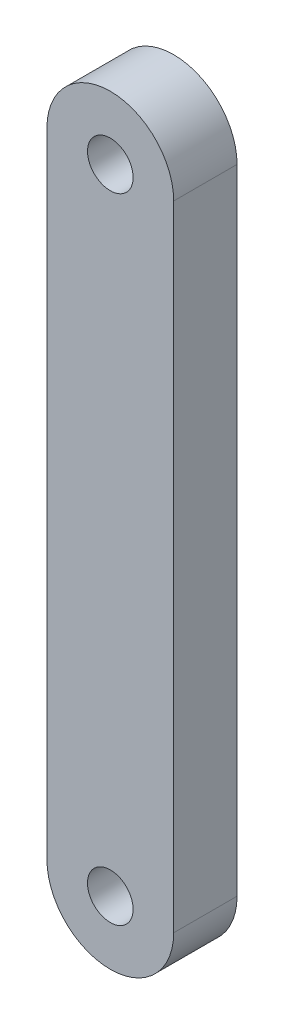
ISO-10303-21;
HEADER;
FILE_DESCRIPTION(('STEP AP214'),'2;1');
FILE_NAME('part.step','',(''),(''),'','','');
FILE_SCHEMA(('AUTOMOTIVE_DESIGN { 1 0 10303 214 1 1 1 1 }'));
ENDSEC;
DATA;
#1=APPLICATION_CONTEXT('core data for automotive mechanical design processes');
#2=APPLICATION_PROTOCOL_DEFINITION('international standard','automotive_design',2000,#1);
#3=PRODUCT_CONTEXT('',#1,'mechanical');
#4=PRODUCT('Part','Part','',(#3));
#5=PRODUCT_RELATED_PRODUCT_CATEGORY('part','',(#4));
#6=PRODUCT_DEFINITION_FORMATION('','',#4);
#7=PRODUCT_DEFINITION_CONTEXT('part definition',#1,'design');
#8=PRODUCT_DEFINITION('design','',#6,#7);
#9=PRODUCT_DEFINITION_SHAPE('','',#8);
#10=(LENGTH_UNIT() NAMED_UNIT(*) SI_UNIT(.MILLI.,.METRE.));
#11=(NAMED_UNIT(*) PLANE_ANGLE_UNIT() SI_UNIT($,.RADIAN.));
#12=(NAMED_UNIT(*) SI_UNIT($,.STERADIAN.) SOLID_ANGLE_UNIT());
#13=UNCERTAINTY_MEASURE_WITH_UNIT(LENGTH_MEASURE(1.E-05),#10,'distance_accuracy_value','');
#14=(GEOMETRIC_REPRESENTATION_CONTEXT(3) GLOBAL_UNCERTAINTY_ASSIGNED_CONTEXT((#13)) GLOBAL_UNIT_ASSIGNED_CONTEXT((#10,
#11,#12)) REPRESENTATION_CONTEXT('',''));
#15=CARTESIAN_POINT('',(0.,0.,0.));
#16=DIRECTION('',(0.,0.,1.));
#17=DIRECTION('',(1.,0.,0.));
#18=AXIS2_PLACEMENT_3D('',#15,#16,#17);
#19=CARTESIAN_POINT('',(0.,25.,5.));
#20=DIRECTION('',(0.,0.,-1.));
#21=DIRECTION('',(-1.,0.,0.));
#22=AXIS2_PLACEMENT_3D('',#19,#20,#21);
#23=CYLINDRICAL_SURFACE('',#22,5.);
#24=CARTESIAN_POINT('',(0.,25.,0.));
#25=DIRECTION('',(0.,0.,1.));
#26=DIRECTION('',(1.,0.,0.));
#27=AXIS2_PLACEMENT_3D('',#24,#25,#26);
#28=CIRCLE('',#27,5.);
#29=CARTESIAN_POINT('',(4.99999999999999,25.,0.));
#30=VERTEX_POINT('',#29);
#31=CARTESIAN_POINT('',(-5.00000000000001,25.,0.));
#32=VERTEX_POINT('',#31);
#33=EDGE_CURVE('E107',#30,#32,#28,.T.);
#34=ORIENTED_EDGE('',*,*,#33,.T.);
#35=DIRECTION('',(0.,0.,-1.));
#36=VECTOR('',#35,1.);
#37=CARTESIAN_POINT('',(-5.00000000000001,25.,5.));
#38=LINE('',#37,#36);
#39=CARTESIAN_POINT('',(-5.00000000000001,25.,5.));
#40=VERTEX_POINT('',#39);
#41=EDGE_CURVE('E11',#40,#32,#38,.T.);
#42=ORIENTED_EDGE('',*,*,#41,.F.);
#43=CARTESIAN_POINT('',(0.,25.,5.));
#44=DIRECTION('',(0.,0.,1.));
#45=DIRECTION('',(1.,0.,0.));
#46=AXIS2_PLACEMENT_3D('',#43,#44,#45);
#47=CIRCLE('',#46,5.);
#48=CARTESIAN_POINT('',(4.99999999999999,25.,5.));
#49=VERTEX_POINT('',#48);
#50=EDGE_CURVE('E91',#49,#40,#47,.T.);
#51=ORIENTED_EDGE('',*,*,#50,.F.);
#52=DIRECTION('',(0.,0.,-1.));
#53=VECTOR('',#52,1.);
#54=CARTESIAN_POINT('',(4.99999999999999,25.,5.));
#55=LINE('',#54,#53);
#56=EDGE_CURVE('E103',#49,#30,#55,.T.);
#57=ORIENTED_EDGE('',*,*,#56,.T.);
#58=EDGE_LOOP('',(#34,#42,#51,#57));
#59=FACE_BOUND('',#58,.T.);
#60=ADVANCED_FACE('F39',(#59),#23,.T.);
#61=CARTESIAN_POINT('',(-5.00000000000001,25.,5.));
#62=DIRECTION('',(1.,0.,0.));
#63=DIRECTION('',(0.,1.,0.));
#64=AXIS2_PLACEMENT_3D('',#61,#62,#63);
#65=PLANE('',#64);
#66=DIRECTION('',(0.,-1.,0.));
#67=VECTOR('',#66,1.);
#68=CARTESIAN_POINT('',(-5.00000000000001,25.,0.));
#69=LINE('',#68,#67);
#70=CARTESIAN_POINT('',(-4.99999999999999,-25.,0.));
#71=VERTEX_POINT('',#70);
#72=EDGE_CURVE('E96',#32,#71,#69,.T.);
#73=ORIENTED_EDGE('',*,*,#72,.T.);
#74=DIRECTION('',(0.,0.,-1.));
#75=VECTOR('',#74,1.);
#76=CARTESIAN_POINT('',(-4.99999999999999,-25.,5.));
#77=LINE('',#76,#75);
#78=CARTESIAN_POINT('',(-4.99999999999999,-25.,5.));
#79=VERTEX_POINT('',#78);
#80=EDGE_CURVE('E48',#79,#71,#77,.T.);
#81=ORIENTED_EDGE('',*,*,#80,.F.);
#82=DIRECTION('',(0.,-1.,0.));
#83=VECTOR('',#82,1.);
#84=CARTESIAN_POINT('',(-5.00000000000001,25.,5.));
#85=LINE('',#84,#83);
#86=EDGE_CURVE('E86',#40,#79,#85,.T.);
#87=ORIENTED_EDGE('',*,*,#86,.F.);
#88=ORIENTED_EDGE('',*,*,#41,.T.);
#89=EDGE_LOOP('',(#73,#81,#87,#88));
#90=FACE_BOUND('',#89,.T.);
#91=ADVANCED_FACE('F95',(#90),#65,.F.);
#92=CARTESIAN_POINT('',(0.,-25.,5.));
#93=DIRECTION('',(0.,0.,-1.));
#94=DIRECTION('',(-1.,0.,0.));
#95=AXIS2_PLACEMENT_3D('',#92,#93,#94);
#96=CYLINDRICAL_SURFACE('',#95,5.);
#97=CARTESIAN_POINT('',(0.,-25.,0.));
#98=DIRECTION('',(0.,0.,1.));
#99=DIRECTION('',(1.,0.,0.));
#100=AXIS2_PLACEMENT_3D('',#97,#98,#99);
#101=CIRCLE('',#100,5.);
#102=CARTESIAN_POINT('',(5.,-25.,0.));
#103=VERTEX_POINT('',#102);
#104=EDGE_CURVE('E73',#71,#103,#101,.T.);
#105=ORIENTED_EDGE('',*,*,#104,.T.);
#106=DIRECTION('',(0.,0.,-1.));
#107=VECTOR('',#106,1.);
#108=CARTESIAN_POINT('',(5.,-25.,5.));
#109=LINE('',#108,#107);
#110=CARTESIAN_POINT('',(5.,-25.,5.));
#111=VERTEX_POINT('',#110);
#112=EDGE_CURVE('E98',#111,#103,#109,.T.);
#113=ORIENTED_EDGE('',*,*,#112,.F.);
#114=CARTESIAN_POINT('',(0.,-25.,5.));
#115=DIRECTION('',(0.,0.,1.));
#116=DIRECTION('',(1.,0.,0.));
#117=AXIS2_PLACEMENT_3D('',#114,#115,#116);
#118=CIRCLE('',#117,5.);
#119=EDGE_CURVE('E89',#79,#111,#118,.T.);
#120=ORIENTED_EDGE('',*,*,#119,.F.);
#121=ORIENTED_EDGE('',*,*,#80,.T.);
#122=EDGE_LOOP('',(#105,#113,#120,#121));
#123=FACE_BOUND('',#122,.T.);
#124=ADVANCED_FACE('F99',(#123),#96,.T.);
#125=CARTESIAN_POINT('',(4.99999999999999,25.,5.));
#126=DIRECTION('',(-1.,0.,0.));
#127=DIRECTION('',(0.,-1.,0.));
#128=AXIS2_PLACEMENT_3D('',#125,#126,#127);
#129=PLANE('',#128);
#130=DIRECTION('',(0.,1.,0.));
#131=VECTOR('',#130,1.);
#132=CARTESIAN_POINT('',(4.99999999999999,25.,0.));
#133=LINE('',#132,#131);
#134=EDGE_CURVE('E79',#103,#30,#133,.T.);
#135=ORIENTED_EDGE('',*,*,#134,.T.);
#136=ORIENTED_EDGE('',*,*,#56,.F.);
#137=DIRECTION('',(0.,1.,0.));
#138=VECTOR('',#137,1.);
#139=CARTESIAN_POINT('',(4.99999999999999,25.,5.));
#140=LINE('',#139,#138);
#141=EDGE_CURVE('E56',#111,#49,#140,.T.);
#142=ORIENTED_EDGE('',*,*,#141,.F.);
#143=ORIENTED_EDGE('',*,*,#112,.T.);
#144=EDGE_LOOP('',(#135,#136,#142,#143));
#145=FACE_BOUND('',#144,.T.);
#146=ADVANCED_FACE('F121',(#145),#129,.F.);
#147=CARTESIAN_POINT('',(0.,25.,5.));
#148=DIRECTION('',(0.,0.,1.));
#149=DIRECTION('',(1.,0.,0.));
#150=AXIS2_PLACEMENT_3D('',#147,#148,#149);
#151=PLANE('',#150);
#152=CARTESIAN_POINT('',(0.,25.,5.));
#153=DIRECTION('',(0.,0.,1.));
#154=DIRECTION('',(1.,0.,0.));
#155=AXIS2_PLACEMENT_3D('',#152,#153,#154);
#156=CIRCLE('',#155,1.8);
#157=CARTESIAN_POINT('',(1.79999999999999,25.,5.));
#158=VERTEX_POINT('',#157);
#159=EDGE_CURVE('E139',#158,#158,#156,.T.);
#160=ORIENTED_EDGE('',*,*,#159,.F.);
#161=EDGE_LOOP('',(#160));
#162=FACE_BOUND('',#161,.T.);
#163=CARTESIAN_POINT('',(0.,-25.,5.));
#164=DIRECTION('',(0.,0.,1.));
#165=DIRECTION('',(1.,0.,0.));
#166=AXIS2_PLACEMENT_3D('',#163,#164,#165);
#167=CIRCLE('',#166,1.8);
#168=CARTESIAN_POINT('',(1.8,-25.,5.));
#169=VERTEX_POINT('',#168);
#170=EDGE_CURVE('E131',#169,#169,#167,.T.);
#171=ORIENTED_EDGE('',*,*,#170,.F.);
#172=EDGE_LOOP('',(#171));
#173=FACE_BOUND('',#172,.T.);
#174=ORIENTED_EDGE('',*,*,#50,.T.);
#175=ORIENTED_EDGE('',*,*,#86,.T.);
#176=ORIENTED_EDGE('',*,*,#119,.T.);
#177=ORIENTED_EDGE('',*,*,#141,.T.);
#178=EDGE_LOOP('',(#174,#175,#176,#177));
#179=FACE_BOUND('',#178,.T.);
#180=ADVANCED_FACE('F87',(#162,#173,#179),#151,.T.);
#181=CARTESIAN_POINT('',(0.,25.,0.));
#182=DIRECTION('',(0.,0.,1.));
#183=DIRECTION('',(1.,0.,0.));
#184=AXIS2_PLACEMENT_3D('',#181,#182,#183);
#185=PLANE('',#184);
#186=CARTESIAN_POINT('',(0.,25.,0.));
#187=DIRECTION('',(0.,0.,1.));
#188=DIRECTION('',(1.,0.,0.));
#189=AXIS2_PLACEMENT_3D('',#186,#187,#188);
#190=CIRCLE('',#189,1.8);
#191=CARTESIAN_POINT('',(1.79999999999999,25.,0.));
#192=VERTEX_POINT('',#191);
#193=EDGE_CURVE('E135',#192,#192,#190,.T.);
#194=ORIENTED_EDGE('',*,*,#193,.T.);
#195=EDGE_LOOP('',(#194));
#196=FACE_BOUND('',#195,.T.);
#197=CARTESIAN_POINT('',(0.,-25.,0.));
#198=DIRECTION('',(0.,0.,1.));
#199=DIRECTION('',(1.,0.,0.));
#200=AXIS2_PLACEMENT_3D('',#197,#198,#199);
#201=CIRCLE('',#200,1.8);
#202=CARTESIAN_POINT('',(1.8,-25.,0.));
#203=VERTEX_POINT('',#202);
#204=EDGE_CURVE('E111',#203,#203,#201,.T.);
#205=ORIENTED_EDGE('',*,*,#204,.T.);
#206=EDGE_LOOP('',(#205));
#207=FACE_BOUND('',#206,.T.);
#208=ORIENTED_EDGE('',*,*,#33,.F.);
#209=ORIENTED_EDGE('',*,*,#134,.F.);
#210=ORIENTED_EDGE('',*,*,#104,.F.);
#211=ORIENTED_EDGE('',*,*,#72,.F.);
#212=EDGE_LOOP('',(#208,#209,#210,#211));
#213=FACE_BOUND('',#212,.T.);
#214=ADVANCED_FACE('F124',(#196,#207,#213),#185,.F.);
#215=CARTESIAN_POINT('',(0.,-25.,5.));
#216=DIRECTION('',(0.,0.,1.));
#217=DIRECTION('',(1.,0.,0.));
#218=AXIS2_PLACEMENT_3D('',#215,#216,#217);
#219=CYLINDRICAL_SURFACE('',#218,1.8);
#220=ORIENTED_EDGE('',*,*,#204,.F.);
#221=EDGE_LOOP('',(#220));
#222=FACE_BOUND('',#221,.T.);
#223=ORIENTED_EDGE('',*,*,#170,.T.);
#224=EDGE_LOOP('',(#223));
#225=FACE_BOUND('',#224,.T.);
#226=ADVANCED_FACE('F151',(#222,#225),#219,.F.);
#227=CARTESIAN_POINT('',(0.,25.,5.));
#228=DIRECTION('',(0.,0.,1.));
#229=DIRECTION('',(1.,0.,0.));
#230=AXIS2_PLACEMENT_3D('',#227,#228,#229);
#231=CYLINDRICAL_SURFACE('',#230,1.8);
#232=ORIENTED_EDGE('',*,*,#193,.F.);
#233=EDGE_LOOP('',(#232));
#234=FACE_BOUND('',#233,.T.);
#235=ORIENTED_EDGE('',*,*,#159,.T.);
#236=EDGE_LOOP('',(#235));
#237=FACE_BOUND('',#236,.T.);
#238=ADVANCED_FACE('F144',(#234,#237),#231,.F.);
#239=CLOSED_SHELL('',(#60,#91,#124,#146,#180,#214,#226,#238));
#240=MANIFOLD_SOLID_BREP('B2',#239);
#241=ADVANCED_BREP_SHAPE_REPRESENTATION('',(#18,#240),#14);
#242=SHAPE_DEFINITION_REPRESENTATION(#9,#241);
ENDSEC;
END-ISO-10303-21;
